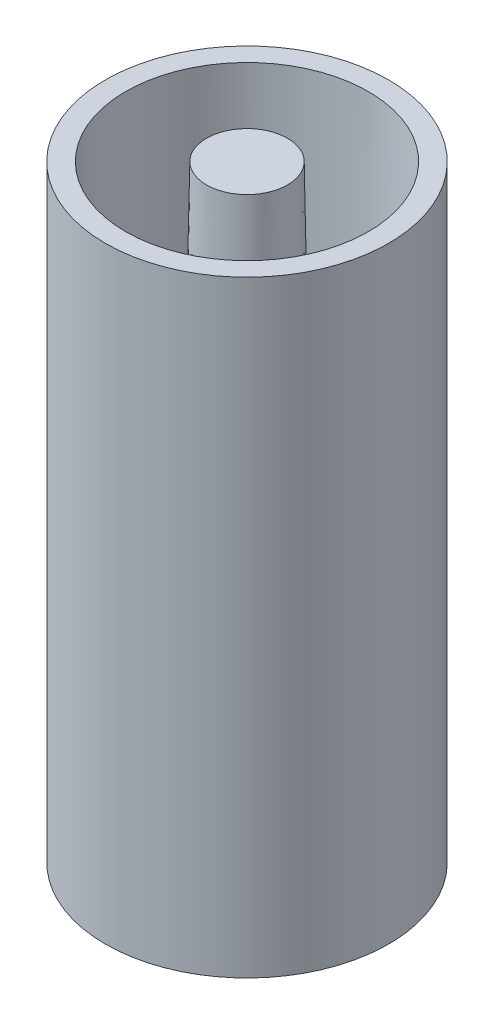
ISO-10303-21;
HEADER;
FILE_DESCRIPTION(('STEP AP214'),'2;1');
FILE_NAME('part.step','',(''),(''),'','','');
FILE_SCHEMA(('AUTOMOTIVE_DESIGN { 1 0 10303 214 1 1 1 1 }'));
ENDSEC;
DATA;
#1=APPLICATION_CONTEXT('core data for automotive mechanical design processes');
#2=APPLICATION_PROTOCOL_DEFINITION('international standard','automotive_design',2000,#1);
#3=PRODUCT_CONTEXT('',#1,'mechanical');
#4=PRODUCT('Part','Part','',(#3));
#5=PRODUCT_RELATED_PRODUCT_CATEGORY('part','',(#4));
#6=PRODUCT_DEFINITION_FORMATION('','',#4);
#7=PRODUCT_DEFINITION_CONTEXT('part definition',#1,'design');
#8=PRODUCT_DEFINITION('design','',#6,#7);
#9=PRODUCT_DEFINITION_SHAPE('','',#8);
#10=(LENGTH_UNIT() NAMED_UNIT(*) SI_UNIT(.MILLI.,.METRE.));
#11=(NAMED_UNIT(*) PLANE_ANGLE_UNIT() SI_UNIT($,.RADIAN.));
#12=(NAMED_UNIT(*) SI_UNIT($,.STERADIAN.) SOLID_ANGLE_UNIT());
#13=UNCERTAINTY_MEASURE_WITH_UNIT(LENGTH_MEASURE(1.E-05),#10,'distance_accuracy_value','');
#14=(GEOMETRIC_REPRESENTATION_CONTEXT(3) GLOBAL_UNCERTAINTY_ASSIGNED_CONTEXT((#13)) GLOBAL_UNIT_ASSIGNED_CONTEXT((#10,
#11,#12)) REPRESENTATION_CONTEXT('',''));
#15=CARTESIAN_POINT('',(0.,0.,0.));
#16=DIRECTION('',(0.,0.,1.));
#17=DIRECTION('',(1.,0.,0.));
#18=AXIS2_PLACEMENT_3D('',#15,#16,#17);
#19=CARTESIAN_POINT('',(0.,95.25,0.));
#20=DIRECTION('',(0.,-1.,0.));
#21=DIRECTION('',(0.,0.,-1.));
#22=AXIS2_PLACEMENT_3D('',#19,#20,#21);
#23=CYLINDRICAL_SURFACE('',#22,22.225);
#24=CARTESIAN_POINT('',(0.,95.25,0.));
#25=DIRECTION('',(0.,1.,0.));
#26=DIRECTION('',(0.,0.,1.));
#27=AXIS2_PLACEMENT_3D('',#24,#25,#26);
#28=CIRCLE('',#27,22.225);
#29=CARTESIAN_POINT('',(0.,95.25,22.225));
#30=VERTEX_POINT('',#29);
#31=EDGE_CURVE('E10',#30,#30,#28,.T.);
#32=ORIENTED_EDGE('',*,*,#31,.F.);
#33=EDGE_LOOP('',(#32));
#34=FACE_BOUND('',#33,.T.);
#35=CARTESIAN_POINT('',(0.,0.,0.));
#36=DIRECTION('',(0.,1.,0.));
#37=DIRECTION('',(0.,0.,1.));
#38=AXIS2_PLACEMENT_3D('',#35,#36,#37);
#39=CIRCLE('',#38,22.225);
#40=CARTESIAN_POINT('',(0.,0.,22.225));
#41=VERTEX_POINT('',#40);
#42=EDGE_CURVE('E34',#41,#41,#39,.T.);
#43=ORIENTED_EDGE('',*,*,#42,.T.);
#44=EDGE_LOOP('',(#43));
#45=FACE_BOUND('',#44,.T.);
#46=ADVANCED_FACE('F31',(#34,#45),#23,.T.);
#47=CARTESIAN_POINT('',(0.,95.25,0.));
#48=DIRECTION('',(0.,1.,0.));
#49=DIRECTION('',(0.,0.,1.));
#50=AXIS2_PLACEMENT_3D('',#47,#48,#49);
#51=PLANE('',#50);
#52=CARTESIAN_POINT('',(0.,95.25,0.));
#53=DIRECTION('',(0.,1.,0.));
#54=DIRECTION('',(0.,0.,1.));
#55=AXIS2_PLACEMENT_3D('',#52,#53,#54);
#56=CIRCLE('',#55,19.05);
#57=CARTESIAN_POINT('',(0.,95.25,19.05));
#58=VERTEX_POINT('',#57);
#59=EDGE_CURVE('E45',#58,#58,#56,.T.);
#60=ORIENTED_EDGE('',*,*,#59,.F.);
#61=EDGE_LOOP('',(#60));
#62=FACE_BOUND('',#61,.T.);
#63=ORIENTED_EDGE('',*,*,#31,.T.);
#64=EDGE_LOOP('',(#63));
#65=FACE_BOUND('',#64,.T.);
#66=ADVANCED_FACE('F67',(#62,#65),#51,.T.);
#67=CARTESIAN_POINT('',(0.,0.,0.));
#68=DIRECTION('',(0.,1.,0.));
#69=DIRECTION('',(0.,0.,1.));
#70=AXIS2_PLACEMENT_3D('',#67,#68,#69);
#71=PLANE('',#70);
#72=ORIENTED_EDGE('',*,*,#42,.F.);
#73=EDGE_LOOP('',(#72));
#74=FACE_BOUND('',#73,.T.);
#75=ADVANCED_FACE('F77',(#74),#71,.F.);
#76=CARTESIAN_POINT('',(0.,95.25,0.));
#77=DIRECTION('',(0.,1.,0.));
#78=DIRECTION('',(0.,0.,1.));
#79=AXIS2_PLACEMENT_3D('',#76,#77,#78);
#80=CONICAL_SURFACE('',#79,19.05,0.0174532925199433);
#81=CARTESIAN_POINT('',(0.,6.35000000000001,0.));
#82=DIRECTION('',(0.,1.,0.));
#83=DIRECTION('',(0.,0.,1.));
#84=AXIS2_PLACEMENT_3D('',#81,#82,#83);
#85=CIRCLE('',#84,17.4982447278815);
#86=CARTESIAN_POINT('',(0.,6.35000000000001,17.4982447278815));
#87=VERTEX_POINT('',#86);
#88=EDGE_CURVE('E41',#87,#87,#85,.T.);
#89=ORIENTED_EDGE('',*,*,#88,.F.);
#90=EDGE_LOOP('',(#89));
#91=FACE_BOUND('',#90,.T.);
#92=ORIENTED_EDGE('',*,*,#59,.T.);
#93=EDGE_LOOP('',(#92));
#94=FACE_BOUND('',#93,.T.);
#95=ADVANCED_FACE('F68',(#91,#94),#80,.F.);
#96=CARTESIAN_POINT('',(0.,6.35000000000001,0.));
#97=DIRECTION('',(0.,1.,0.));
#98=DIRECTION('',(0.,0.,1.));
#99=AXIS2_PLACEMENT_3D('',#96,#97,#98);
#100=PLANE('',#99);
#101=CARTESIAN_POINT('',(0.,6.35000000000001,0.));
#102=DIRECTION('',(0.,1.,0.));
#103=DIRECTION('',(0.,0.,1.));
#104=AXIS2_PLACEMENT_3D('',#101,#102,#103);
#105=CIRCLE('',#104,7.90175527211855);
#106=CARTESIAN_POINT('',(0.,6.35000000000001,7.90175527211855));
#107=VERTEX_POINT('',#106);
#108=EDGE_CURVE('E46',#107,#107,#105,.T.);
#109=ORIENTED_EDGE('',*,*,#108,.F.);
#110=EDGE_LOOP('',(#109));
#111=FACE_BOUND('',#110,.T.);
#112=ORIENTED_EDGE('',*,*,#88,.T.);
#113=EDGE_LOOP('',(#112));
#114=FACE_BOUND('',#113,.T.);
#115=ADVANCED_FACE('F59',(#111,#114),#100,.T.);
#116=CARTESIAN_POINT('',(0.,95.25,0.));
#117=DIRECTION('',(0.,-1.,0.));
#118=DIRECTION('',(0.,0.,1.));
#119=AXIS2_PLACEMENT_3D('',#116,#117,#118);
#120=CONICAL_SURFACE('',#119,6.35,0.0174532925199433);
#121=ORIENTED_EDGE('',*,*,#108,.T.);
#122=EDGE_LOOP('',(#121));
#123=FACE_BOUND('',#122,.T.);
#124=CARTESIAN_POINT('',(0.,95.25,0.));
#125=DIRECTION('',(0.,1.,0.));
#126=DIRECTION('',(0.,0.,1.));
#127=AXIS2_PLACEMENT_3D('',#124,#125,#126);
#128=CIRCLE('',#127,6.35);
#129=CARTESIAN_POINT('',(0.,95.25,6.35));
#130=VERTEX_POINT('',#129);
#131=EDGE_CURVE('E49',#130,#130,#128,.T.);
#132=ORIENTED_EDGE('',*,*,#131,.F.);
#133=EDGE_LOOP('',(#132));
#134=FACE_BOUND('',#133,.T.);
#135=ADVANCED_FACE('F57',(#123,#134),#120,.T.);
#136=ORIENTED_EDGE('',*,*,#131,.T.);
#137=EDGE_LOOP('',(#136));
#138=FACE_BOUND('',#137,.T.);
#139=ADVANCED_FACE('F55',(#138),#51,.T.);
#140=CLOSED_SHELL('',(#46,#66,#75,#95,#115,#135,#139));
#141=MANIFOLD_SOLID_BREP('B2',#140);
#142=ADVANCED_BREP_SHAPE_REPRESENTATION('',(#18,#141),#14);
#143=SHAPE_DEFINITION_REPRESENTATION(#9,#142);
ENDSEC;
END-ISO-10303-21;
